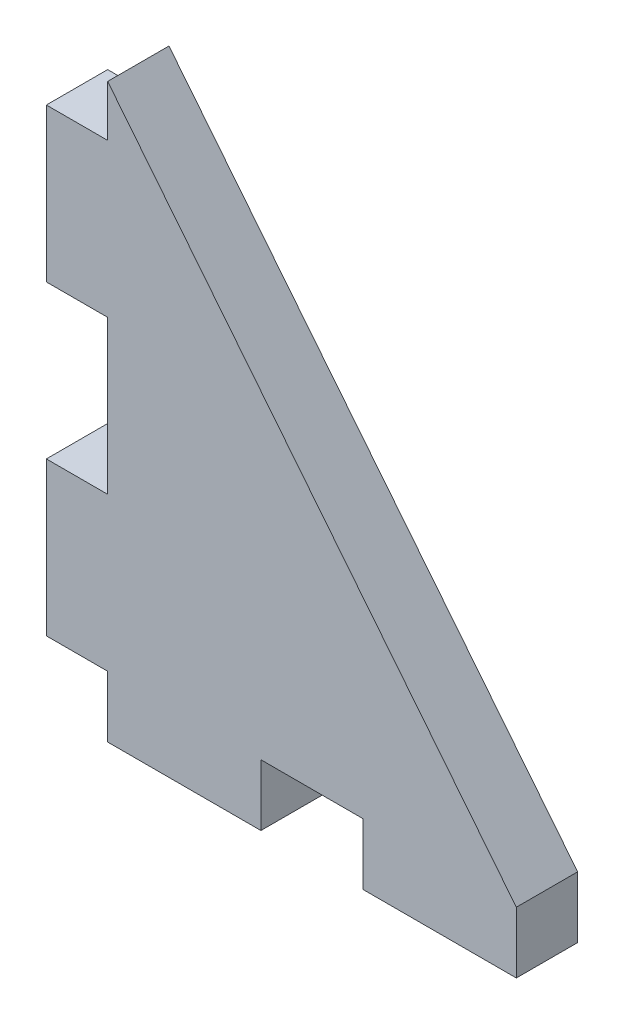
ISO-10303-21;
HEADER;
FILE_DESCRIPTION(('STEP AP214'),'2;1');
FILE_NAME('part.step','',(''),(''),'','','');
FILE_SCHEMA(('AUTOMOTIVE_DESIGN { 1 0 10303 214 1 1 1 1 }'));
ENDSEC;
DATA;
#1=APPLICATION_CONTEXT('core data for automotive mechanical design processes');
#2=APPLICATION_PROTOCOL_DEFINITION('international standard','automotive_design',2000,#1);
#3=PRODUCT_CONTEXT('',#1,'mechanical');
#4=PRODUCT('Part','Part','',(#3));
#5=PRODUCT_RELATED_PRODUCT_CATEGORY('part','',(#4));
#6=PRODUCT_DEFINITION_FORMATION('','',#4);
#7=PRODUCT_DEFINITION_CONTEXT('part definition',#1,'design');
#8=PRODUCT_DEFINITION('design','',#6,#7);
#9=PRODUCT_DEFINITION_SHAPE('','',#8);
#10=(LENGTH_UNIT() NAMED_UNIT(*) SI_UNIT(.MILLI.,.METRE.));
#11=(NAMED_UNIT(*) PLANE_ANGLE_UNIT() SI_UNIT($,.RADIAN.));
#12=(NAMED_UNIT(*) SI_UNIT($,.STERADIAN.) SOLID_ANGLE_UNIT());
#13=UNCERTAINTY_MEASURE_WITH_UNIT(LENGTH_MEASURE(1.E-05),#10,'distance_accuracy_value','');
#14=(GEOMETRIC_REPRESENTATION_CONTEXT(3) GLOBAL_UNCERTAINTY_ASSIGNED_CONTEXT((#13)) GLOBAL_UNIT_ASSIGNED_CONTEXT((#10,
#11,#12)) REPRESENTATION_CONTEXT('',''));
#15=CARTESIAN_POINT('',(0.,0.,0.));
#16=DIRECTION('',(0.,0.,1.));
#17=DIRECTION('',(1.,0.,0.));
#18=AXIS2_PLACEMENT_3D('',#15,#16,#17);
#19=CARTESIAN_POINT('',(0.,0.,3.));
#20=DIRECTION('',(1.,0.,0.));
#21=DIRECTION('',(0.,1.,0.));
#22=AXIS2_PLACEMENT_3D('',#19,#20,#21);
#23=PLANE('',#22);
#24=DIRECTION('',(0.,-1.,0.));
#25=VECTOR('',#24,1.);
#26=CARTESIAN_POINT('',(0.,0.,-3.));
#27=LINE('',#26,#25);
#28=CARTESIAN_POINT('',(0.,0.,-3.));
#29=VERTEX_POINT('',#28);
#30=CARTESIAN_POINT('',(0.,-6.,-3.));
#31=VERTEX_POINT('',#30);
#32=EDGE_CURVE('E179',#29,#31,#27,.T.);
#33=ORIENTED_EDGE('',*,*,#32,.T.);
#34=DIRECTION('',(0.,0.,-1.));
#35=VECTOR('',#34,1.);
#36=CARTESIAN_POINT('',(0.,-6.,3.));
#37=LINE('',#36,#35);
#38=CARTESIAN_POINT('',(0.,-6.,3.));
#39=VERTEX_POINT('',#38);
#40=EDGE_CURVE('E11',#39,#31,#37,.T.);
#41=ORIENTED_EDGE('',*,*,#40,.F.);
#42=DIRECTION('',(0.,-1.,0.));
#43=VECTOR('',#42,1.);
#44=CARTESIAN_POINT('',(0.,0.,3.));
#45=LINE('',#44,#43);
#46=CARTESIAN_POINT('',(0.,0.,3.));
#47=VERTEX_POINT('',#46);
#48=EDGE_CURVE('E209',#47,#39,#45,.T.);
#49=ORIENTED_EDGE('',*,*,#48,.F.);
#50=DIRECTION('',(0.,0.,-1.));
#51=VECTOR('',#50,1.);
#52=CARTESIAN_POINT('',(0.,0.,3.));
#53=LINE('',#52,#51);
#54=EDGE_CURVE('E175',#47,#29,#53,.T.);
#55=ORIENTED_EDGE('',*,*,#54,.T.);
#56=EDGE_LOOP('',(#33,#41,#49,#55));
#57=FACE_BOUND('',#56,.T.);
#58=ADVANCED_FACE('F35',(#57),#23,.F.);
#59=CARTESIAN_POINT('',(0.,-6.,3.));
#60=DIRECTION('',(0.,1.,0.));
#61=DIRECTION('',(0.,0.,1.));
#62=AXIS2_PLACEMENT_3D('',#59,#60,#61);
#63=PLANE('',#62);
#64=DIRECTION('',(1.,0.,0.));
#65=VECTOR('',#64,1.);
#66=CARTESIAN_POINT('',(0.,-6.,-3.));
#67=LINE('',#66,#65);
#68=CARTESIAN_POINT('',(15.,-6.,-3.));
#69=VERTEX_POINT('',#68);
#70=EDGE_CURVE('E182',#31,#69,#67,.T.);
#71=ORIENTED_EDGE('',*,*,#70,.T.);
#72=DIRECTION('',(0.,0.,-1.));
#73=VECTOR('',#72,1.);
#74=CARTESIAN_POINT('',(15.,-6.,3.));
#75=LINE('',#74,#73);
#76=CARTESIAN_POINT('',(15.,-6.,3.));
#77=VERTEX_POINT('',#76);
#78=EDGE_CURVE('E43',#77,#69,#75,.T.);
#79=ORIENTED_EDGE('',*,*,#78,.F.);
#80=DIRECTION('',(1.,0.,0.));
#81=VECTOR('',#80,1.);
#82=CARTESIAN_POINT('',(0.,-6.,3.));
#83=LINE('',#82,#81);
#84=EDGE_CURVE('E118',#39,#77,#83,.T.);
#85=ORIENTED_EDGE('',*,*,#84,.F.);
#86=ORIENTED_EDGE('',*,*,#40,.T.);
#87=EDGE_LOOP('',(#71,#79,#85,#86));
#88=FACE_BOUND('',#87,.T.);
#89=ADVANCED_FACE('F307',(#88),#63,.F.);
#90=CARTESIAN_POINT('',(15.,0.,3.));
#91=DIRECTION('',(-1.,0.,0.));
#92=DIRECTION('',(0.,0.,1.));
#93=AXIS2_PLACEMENT_3D('',#90,#91,#92);
#94=PLANE('',#93);
#95=DIRECTION('',(0.,1.,0.));
#96=VECTOR('',#95,1.);
#97=CARTESIAN_POINT('',(15.,0.,-3.));
#98=LINE('',#97,#96);
#99=CARTESIAN_POINT('',(15.,0.,-3.));
#100=VERTEX_POINT('',#99);
#101=EDGE_CURVE('E184',#69,#100,#98,.T.);
#102=ORIENTED_EDGE('',*,*,#101,.T.);
#103=DIRECTION('',(0.,0.,-1.));
#104=VECTOR('',#103,1.);
#105=CARTESIAN_POINT('',(15.,0.,3.));
#106=LINE('',#105,#104);
#107=CARTESIAN_POINT('',(15.,0.,3.));
#108=VERTEX_POINT('',#107);
#109=EDGE_CURVE('E240',#108,#100,#106,.T.);
#110=ORIENTED_EDGE('',*,*,#109,.F.);
#111=DIRECTION('',(0.,1.,0.));
#112=VECTOR('',#111,1.);
#113=CARTESIAN_POINT('',(15.,0.,3.));
#114=LINE('',#113,#112);
#115=EDGE_CURVE('E248',#77,#108,#114,.T.);
#116=ORIENTED_EDGE('',*,*,#115,.F.);
#117=ORIENTED_EDGE('',*,*,#78,.T.);
#118=EDGE_LOOP('',(#102,#110,#116,#117));
#119=FACE_BOUND('',#118,.T.);
#120=ADVANCED_FACE('F246',(#119),#94,.F.);
#121=CARTESIAN_POINT('',(25.,0.,3.));
#122=DIRECTION('',(0.,1.,0.));
#123=DIRECTION('',(-1.,0.,0.));
#124=AXIS2_PLACEMENT_3D('',#121,#122,#123);
#125=PLANE('',#124);
#126=DIRECTION('',(1.,0.,0.));
#127=VECTOR('',#126,1.);
#128=CARTESIAN_POINT('',(25.,0.,-3.));
#129=LINE('',#128,#127);
#130=CARTESIAN_POINT('',(25.,0.,-3.));
#131=VERTEX_POINT('',#130);
#132=EDGE_CURVE('E186',#100,#131,#129,.T.);
#133=ORIENTED_EDGE('',*,*,#132,.T.);
#134=DIRECTION('',(0.,0.,-1.));
#135=VECTOR('',#134,1.);
#136=CARTESIAN_POINT('',(25.,0.,3.));
#137=LINE('',#136,#135);
#138=CARTESIAN_POINT('',(25.,0.,3.));
#139=VERTEX_POINT('',#138);
#140=EDGE_CURVE('E237',#139,#131,#137,.T.);
#141=ORIENTED_EDGE('',*,*,#140,.F.);
#142=DIRECTION('',(1.,0.,0.));
#143=VECTOR('',#142,1.);
#144=CARTESIAN_POINT('',(25.,0.,3.));
#145=LINE('',#144,#143);
#146=EDGE_CURVE('E266',#108,#139,#145,.T.);
#147=ORIENTED_EDGE('',*,*,#146,.F.);
#148=ORIENTED_EDGE('',*,*,#109,.T.);
#149=EDGE_LOOP('',(#133,#141,#147,#148));
#150=FACE_BOUND('',#149,.T.);
#151=ADVANCED_FACE('F257',(#150),#125,.F.);
#152=CARTESIAN_POINT('',(25.,0.,3.));
#153=DIRECTION('',(1.,0.,0.));
#154=DIRECTION('',(0.,0.,-1.));
#155=AXIS2_PLACEMENT_3D('',#152,#153,#154);
#156=PLANE('',#155);
#157=DIRECTION('',(0.,-1.,0.));
#158=VECTOR('',#157,1.);
#159=CARTESIAN_POINT('',(25.,0.,-3.));
#160=LINE('',#159,#158);
#161=CARTESIAN_POINT('',(25.,-6.,-3.));
#162=VERTEX_POINT('',#161);
#163=EDGE_CURVE('E188',#131,#162,#160,.T.);
#164=ORIENTED_EDGE('',*,*,#163,.T.);
#165=DIRECTION('',(0.,0.,-1.));
#166=VECTOR('',#165,1.);
#167=CARTESIAN_POINT('',(25.,-6.,3.));
#168=LINE('',#167,#166);
#169=CARTESIAN_POINT('',(25.,-6.,3.));
#170=VERTEX_POINT('',#169);
#171=EDGE_CURVE('E234',#170,#162,#168,.T.);
#172=ORIENTED_EDGE('',*,*,#171,.F.);
#173=DIRECTION('',(0.,-1.,0.));
#174=VECTOR('',#173,1.);
#175=CARTESIAN_POINT('',(25.,0.,3.));
#176=LINE('',#175,#174);
#177=EDGE_CURVE('E263',#139,#170,#176,.T.);
#178=ORIENTED_EDGE('',*,*,#177,.F.);
#179=ORIENTED_EDGE('',*,*,#140,.T.);
#180=EDGE_LOOP('',(#164,#172,#178,#179));
#181=FACE_BOUND('',#180,.T.);
#182=ADVANCED_FACE('F261',(#181),#156,.F.);
#183=CARTESIAN_POINT('',(25.,-6.,3.));
#184=DIRECTION('',(0.,1.,0.));
#185=DIRECTION('',(0.,0.,1.));
#186=AXIS2_PLACEMENT_3D('',#183,#184,#185);
#187=PLANE('',#186);
#188=DIRECTION('',(1.,0.,0.));
#189=VECTOR('',#188,1.);
#190=CARTESIAN_POINT('',(25.,-6.,-3.));
#191=LINE('',#190,#189);
#192=CARTESIAN_POINT('',(40.,-6.,-3.));
#193=VERTEX_POINT('',#192);
#194=EDGE_CURVE('E190',#162,#193,#191,.T.);
#195=ORIENTED_EDGE('',*,*,#194,.T.);
#196=DIRECTION('',(0.,0.,-1.));
#197=VECTOR('',#196,1.);
#198=CARTESIAN_POINT('',(40.,-6.,3.));
#199=LINE('',#198,#197);
#200=CARTESIAN_POINT('',(40.,-6.,3.));
#201=VERTEX_POINT('',#200);
#202=EDGE_CURVE('E231',#201,#193,#199,.T.);
#203=ORIENTED_EDGE('',*,*,#202,.F.);
#204=DIRECTION('',(1.,0.,0.));
#205=VECTOR('',#204,1.);
#206=CARTESIAN_POINT('',(25.,-6.,3.));
#207=LINE('',#206,#205);
#208=EDGE_CURVE('E265',#170,#201,#207,.T.);
#209=ORIENTED_EDGE('',*,*,#208,.F.);
#210=ORIENTED_EDGE('',*,*,#171,.T.);
#211=EDGE_LOOP('',(#195,#203,#209,#210));
#212=FACE_BOUND('',#211,.T.);
#213=ADVANCED_FACE('F320',(#212),#187,.F.);
#214=CARTESIAN_POINT('',(40.,0.,3.));
#215=DIRECTION('',(-1.,0.,0.));
#216=DIRECTION('',(0.,0.,1.));
#217=AXIS2_PLACEMENT_3D('',#214,#215,#216);
#218=PLANE('',#217);
#219=DIRECTION('',(0.,1.,0.));
#220=VECTOR('',#219,1.);
#221=CARTESIAN_POINT('',(40.,0.,-3.));
#222=LINE('',#221,#220);
#223=CARTESIAN_POINT('',(40.,0.,-3.));
#224=VERTEX_POINT('',#223);
#225=EDGE_CURVE('E192',#193,#224,#222,.T.);
#226=ORIENTED_EDGE('',*,*,#225,.T.);
#227=DIRECTION('',(0.,0.,-1.));
#228=VECTOR('',#227,1.);
#229=CARTESIAN_POINT('',(40.,0.,3.));
#230=LINE('',#229,#228);
#231=CARTESIAN_POINT('',(40.,0.,3.));
#232=VERTEX_POINT('',#231);
#233=EDGE_CURVE('E228',#232,#224,#230,.T.);
#234=ORIENTED_EDGE('',*,*,#233,.F.);
#235=DIRECTION('',(0.,1.,0.));
#236=VECTOR('',#235,1.);
#237=CARTESIAN_POINT('',(40.,0.,3.));
#238=LINE('',#237,#236);
#239=EDGE_CURVE('E268',#201,#232,#238,.T.);
#240=ORIENTED_EDGE('',*,*,#239,.F.);
#241=ORIENTED_EDGE('',*,*,#202,.T.);
#242=EDGE_LOOP('',(#226,#234,#240,#241));
#243=FACE_BOUND('',#242,.T.);
#244=ADVANCED_FACE('F323',(#243),#218,.F.);
#245=CARTESIAN_POINT('',(0.,50.,3.));
#246=DIRECTION('',(-0.78086880944303,-0.624695047554424,0.));
#247=DIRECTION('',(0.624695047554424,-0.78086880944303,0.));
#248=AXIS2_PLACEMENT_3D('',#245,#246,#247);
#249=PLANE('',#248);
#250=DIRECTION('',(-0.624695047554424,0.78086880944303,0.));
#251=VECTOR('',#250,1.);
#252=CARTESIAN_POINT('',(0.,50.,-3.));
#253=LINE('',#252,#251);
#254=CARTESIAN_POINT('',(0.,50.,-3.));
#255=VERTEX_POINT('',#254);
#256=EDGE_CURVE('E194',#224,#255,#253,.T.);
#257=ORIENTED_EDGE('',*,*,#256,.T.);
#258=DIRECTION('',(0.,0.,-1.));
#259=VECTOR('',#258,1.);
#260=CARTESIAN_POINT('',(0.,50.,3.));
#261=LINE('',#260,#259);
#262=CARTESIAN_POINT('',(0.,50.,3.));
#263=VERTEX_POINT('',#262);
#264=EDGE_CURVE('E225',#263,#255,#261,.T.);
#265=ORIENTED_EDGE('',*,*,#264,.F.);
#266=DIRECTION('',(-0.624695047554424,0.78086880944303,0.));
#267=VECTOR('',#266,1.);
#268=CARTESIAN_POINT('',(0.,50.,3.));
#269=LINE('',#268,#267);
#270=EDGE_CURVE('E274',#232,#263,#269,.T.);
#271=ORIENTED_EDGE('',*,*,#270,.F.);
#272=ORIENTED_EDGE('',*,*,#233,.T.);
#273=EDGE_LOOP('',(#257,#265,#271,#272));
#274=FACE_BOUND('',#273,.T.);
#275=ADVANCED_FACE('F327',(#274),#249,.F.);
#276=CARTESIAN_POINT('',(0.,45.,3.));
#277=DIRECTION('',(1.,0.,0.));
#278=DIRECTION('',(0.,1.,0.));
#279=AXIS2_PLACEMENT_3D('',#276,#277,#278);
#280=PLANE('',#279);
#281=DIRECTION('',(0.,-1.,0.));
#282=VECTOR('',#281,1.);
#283=CARTESIAN_POINT('',(0.,45.,-3.));
#284=LINE('',#283,#282);
#285=CARTESIAN_POINT('',(0.,45.,-3.));
#286=VERTEX_POINT('',#285);
#287=EDGE_CURVE('E196',#255,#286,#284,.T.);
#288=ORIENTED_EDGE('',*,*,#287,.T.);
#289=DIRECTION('',(0.,0.,-1.));
#290=VECTOR('',#289,1.);
#291=CARTESIAN_POINT('',(0.,45.,3.));
#292=LINE('',#291,#290);
#293=CARTESIAN_POINT('',(0.,45.,3.));
#294=VERTEX_POINT('',#293);
#295=EDGE_CURVE('E222',#294,#286,#292,.T.);
#296=ORIENTED_EDGE('',*,*,#295,.F.);
#297=DIRECTION('',(0.,-1.,0.));
#298=VECTOR('',#297,1.);
#299=CARTESIAN_POINT('',(0.,45.,3.));
#300=LINE('',#299,#298);
#301=EDGE_CURVE('E276',#263,#294,#300,.T.);
#302=ORIENTED_EDGE('',*,*,#301,.F.);
#303=ORIENTED_EDGE('',*,*,#264,.T.);
#304=EDGE_LOOP('',(#288,#296,#302,#303));
#305=FACE_BOUND('',#304,.T.);
#306=ADVANCED_FACE('F331',(#305),#280,.F.);
#307=CARTESIAN_POINT('',(0.,45.,3.));
#308=DIRECTION('',(0.,-1.,0.));
#309=DIRECTION('',(0.,0.,-1.));
#310=AXIS2_PLACEMENT_3D('',#307,#308,#309);
#311=PLANE('',#310);
#312=DIRECTION('',(-1.,0.,0.));
#313=VECTOR('',#312,1.);
#314=CARTESIAN_POINT('',(0.,45.,-3.));
#315=LINE('',#314,#313);
#316=CARTESIAN_POINT('',(-6.,45.,-3.));
#317=VERTEX_POINT('',#316);
#318=EDGE_CURVE('E198',#286,#317,#315,.T.);
#319=ORIENTED_EDGE('',*,*,#318,.T.);
#320=DIRECTION('',(0.,0.,-1.));
#321=VECTOR('',#320,1.);
#322=CARTESIAN_POINT('',(-6.,45.,3.));
#323=LINE('',#322,#321);
#324=CARTESIAN_POINT('',(-6.,45.,3.));
#325=VERTEX_POINT('',#324);
#326=EDGE_CURVE('E219',#325,#317,#323,.T.);
#327=ORIENTED_EDGE('',*,*,#326,.F.);
#328=DIRECTION('',(-1.,0.,0.));
#329=VECTOR('',#328,1.);
#330=CARTESIAN_POINT('',(0.,45.,3.));
#331=LINE('',#330,#329);
#332=EDGE_CURVE('E278',#294,#325,#331,.T.);
#333=ORIENTED_EDGE('',*,*,#332,.F.);
#334=ORIENTED_EDGE('',*,*,#295,.T.);
#335=EDGE_LOOP('',(#319,#327,#333,#334));
#336=FACE_BOUND('',#335,.T.);
#337=ADVANCED_FACE('F335',(#336),#311,.F.);
#338=CARTESIAN_POINT('',(-6.,45.,3.));
#339=DIRECTION('',(1.,0.,0.));
#340=DIRECTION('',(0.,1.,0.));
#341=AXIS2_PLACEMENT_3D('',#338,#339,#340);
#342=PLANE('',#341);
#343=DIRECTION('',(0.,-1.,0.));
#344=VECTOR('',#343,1.);
#345=CARTESIAN_POINT('',(-6.,45.,-3.));
#346=LINE('',#345,#344);
#347=CARTESIAN_POINT('',(-5.99999999999999,30.,-3.));
#348=VERTEX_POINT('',#347);
#349=EDGE_CURVE('E200',#317,#348,#346,.T.);
#350=ORIENTED_EDGE('',*,*,#349,.T.);
#351=DIRECTION('',(0.,0.,-1.));
#352=VECTOR('',#351,1.);
#353=CARTESIAN_POINT('',(-5.99999999999999,30.,3.));
#354=LINE('',#353,#352);
#355=CARTESIAN_POINT('',(-5.99999999999999,30.,3.));
#356=VERTEX_POINT('',#355);
#357=EDGE_CURVE('E216',#356,#348,#354,.T.);
#358=ORIENTED_EDGE('',*,*,#357,.F.);
#359=DIRECTION('',(0.,-1.,0.));
#360=VECTOR('',#359,1.);
#361=CARTESIAN_POINT('',(-6.,45.,3.));
#362=LINE('',#361,#360);
#363=EDGE_CURVE('E280',#325,#356,#362,.T.);
#364=ORIENTED_EDGE('',*,*,#363,.F.);
#365=ORIENTED_EDGE('',*,*,#326,.T.);
#366=EDGE_LOOP('',(#350,#358,#364,#365));
#367=FACE_BOUND('',#366,.T.);
#368=ADVANCED_FACE('F339',(#367),#342,.F.);
#369=CARTESIAN_POINT('',(0.,30.,3.));
#370=DIRECTION('',(0.,1.,0.));
#371=DIRECTION('',(0.,0.,1.));
#372=AXIS2_PLACEMENT_3D('',#369,#370,#371);
#373=PLANE('',#372);
#374=DIRECTION('',(1.,0.,0.));
#375=VECTOR('',#374,1.);
#376=CARTESIAN_POINT('',(0.,30.,-3.));
#377=LINE('',#376,#375);
#378=CARTESIAN_POINT('',(0.,30.,-3.));
#379=VERTEX_POINT('',#378);
#380=EDGE_CURVE('E202',#348,#379,#377,.T.);
#381=ORIENTED_EDGE('',*,*,#380,.T.);
#382=DIRECTION('',(0.,0.,-1.));
#383=VECTOR('',#382,1.);
#384=CARTESIAN_POINT('',(0.,30.,3.));
#385=LINE('',#384,#383);
#386=CARTESIAN_POINT('',(0.,30.,3.));
#387=VERTEX_POINT('',#386);
#388=EDGE_CURVE('E213',#387,#379,#385,.T.);
#389=ORIENTED_EDGE('',*,*,#388,.F.);
#390=DIRECTION('',(1.,0.,0.));
#391=VECTOR('',#390,1.);
#392=CARTESIAN_POINT('',(0.,30.,3.));
#393=LINE('',#392,#391);
#394=EDGE_CURVE('E282',#356,#387,#393,.T.);
#395=ORIENTED_EDGE('',*,*,#394,.F.);
#396=ORIENTED_EDGE('',*,*,#357,.T.);
#397=EDGE_LOOP('',(#381,#389,#395,#396));
#398=FACE_BOUND('',#397,.T.);
#399=ADVANCED_FACE('F288',(#398),#373,.F.);
#400=CARTESIAN_POINT('',(0.,15.,3.));
#401=DIRECTION('',(1.,0.,0.));
#402=DIRECTION('',(0.,1.,0.));
#403=AXIS2_PLACEMENT_3D('',#400,#401,#402);
#404=PLANE('',#403);
#405=DIRECTION('',(0.,-1.,0.));
#406=VECTOR('',#405,1.);
#407=CARTESIAN_POINT('',(0.,15.,-3.));
#408=LINE('',#407,#406);
#409=CARTESIAN_POINT('',(0.,15.,-3.));
#410=VERTEX_POINT('',#409);
#411=EDGE_CURVE('E204',#379,#410,#408,.T.);
#412=ORIENTED_EDGE('',*,*,#411,.T.);
#413=DIRECTION('',(0.,0.,-1.));
#414=VECTOR('',#413,1.);
#415=CARTESIAN_POINT('',(0.,15.,3.));
#416=LINE('',#415,#414);
#417=CARTESIAN_POINT('',(0.,15.,3.));
#418=VERTEX_POINT('',#417);
#419=EDGE_CURVE('E170',#418,#410,#416,.T.);
#420=ORIENTED_EDGE('',*,*,#419,.F.);
#421=DIRECTION('',(0.,-1.,0.));
#422=VECTOR('',#421,1.);
#423=CARTESIAN_POINT('',(0.,15.,3.));
#424=LINE('',#423,#422);
#425=EDGE_CURVE('E161',#387,#418,#424,.T.);
#426=ORIENTED_EDGE('',*,*,#425,.F.);
#427=ORIENTED_EDGE('',*,*,#388,.T.);
#428=EDGE_LOOP('',(#412,#420,#426,#427));
#429=FACE_BOUND('',#428,.T.);
#430=ADVANCED_FACE('F292',(#429),#404,.F.);
#431=CARTESIAN_POINT('',(0.,15.,3.));
#432=DIRECTION('',(0.,-1.,0.));
#433=DIRECTION('',(0.,0.,-1.));
#434=AXIS2_PLACEMENT_3D('',#431,#432,#433);
#435=PLANE('',#434);
#436=DIRECTION('',(-1.,0.,0.));
#437=VECTOR('',#436,1.);
#438=CARTESIAN_POINT('',(0.,15.,-3.));
#439=LINE('',#438,#437);
#440=CARTESIAN_POINT('',(-6.,15.,-3.));
#441=VERTEX_POINT('',#440);
#442=EDGE_CURVE('E169',#410,#441,#439,.T.);
#443=ORIENTED_EDGE('',*,*,#442,.T.);
#444=DIRECTION('',(0.,0.,-1.));
#445=VECTOR('',#444,1.);
#446=CARTESIAN_POINT('',(-6.,15.,3.));
#447=LINE('',#446,#445);
#448=CARTESIAN_POINT('',(-6.,15.,3.));
#449=VERTEX_POINT('',#448);
#450=EDGE_CURVE('E166',#449,#441,#447,.T.);
#451=ORIENTED_EDGE('',*,*,#450,.F.);
#452=DIRECTION('',(-1.,0.,0.));
#453=VECTOR('',#452,1.);
#454=CARTESIAN_POINT('',(0.,15.,3.));
#455=LINE('',#454,#453);
#456=EDGE_CURVE('E155',#418,#449,#455,.T.);
#457=ORIENTED_EDGE('',*,*,#456,.F.);
#458=ORIENTED_EDGE('',*,*,#419,.T.);
#459=EDGE_LOOP('',(#443,#451,#457,#458));
#460=FACE_BOUND('',#459,.T.);
#461=ADVANCED_FACE('F167',(#460),#435,.F.);
#462=CARTESIAN_POINT('',(-6.,0.,3.));
#463=DIRECTION('',(1.,0.,0.));
#464=DIRECTION('',(0.,0.,-1.));
#465=AXIS2_PLACEMENT_3D('',#462,#463,#464);
#466=PLANE('',#465);
#467=DIRECTION('',(0.,-1.,0.));
#468=VECTOR('',#467,1.);
#469=CARTESIAN_POINT('',(-6.,0.,-3.));
#470=LINE('',#469,#468);
#471=CARTESIAN_POINT('',(-6.,0.,-3.));
#472=VERTEX_POINT('',#471);
#473=EDGE_CURVE('E104',#441,#472,#470,.T.);
#474=ORIENTED_EDGE('',*,*,#473,.T.);
#475=DIRECTION('',(0.,0.,-1.));
#476=VECTOR('',#475,1.);
#477=CARTESIAN_POINT('',(-6.,0.,3.));
#478=LINE('',#477,#476);
#479=CARTESIAN_POINT('',(-6.,0.,3.));
#480=VERTEX_POINT('',#479);
#481=EDGE_CURVE('E171',#480,#472,#478,.T.);
#482=ORIENTED_EDGE('',*,*,#481,.F.);
#483=DIRECTION('',(0.,-1.,0.));
#484=VECTOR('',#483,1.);
#485=CARTESIAN_POINT('',(-6.,0.,3.));
#486=LINE('',#485,#484);
#487=EDGE_CURVE('E159',#449,#480,#486,.T.);
#488=ORIENTED_EDGE('',*,*,#487,.F.);
#489=ORIENTED_EDGE('',*,*,#450,.T.);
#490=EDGE_LOOP('',(#474,#482,#488,#489));
#491=FACE_BOUND('',#490,.T.);
#492=ADVANCED_FACE('F173',(#491),#466,.F.);
#493=CARTESIAN_POINT('',(0.,0.,3.));
#494=DIRECTION('',(0.,1.,0.));
#495=DIRECTION('',(-1.,0.,0.));
#496=AXIS2_PLACEMENT_3D('',#493,#494,#495);
#497=PLANE('',#496);
#498=DIRECTION('',(1.,0.,0.));
#499=VECTOR('',#498,1.);
#500=CARTESIAN_POINT('',(0.,0.,-3.));
#501=LINE('',#500,#499);
#502=EDGE_CURVE('E110',#472,#29,#501,.T.);
#503=ORIENTED_EDGE('',*,*,#502,.T.);
#504=ORIENTED_EDGE('',*,*,#54,.F.);
#505=DIRECTION('',(1.,0.,0.));
#506=VECTOR('',#505,1.);
#507=CARTESIAN_POINT('',(0.,0.,3.));
#508=LINE('',#507,#506);
#509=EDGE_CURVE('E51',#480,#47,#508,.T.);
#510=ORIENTED_EDGE('',*,*,#509,.F.);
#511=ORIENTED_EDGE('',*,*,#481,.T.);
#512=EDGE_LOOP('',(#503,#504,#510,#511));
#513=FACE_BOUND('',#512,.T.);
#514=ADVANCED_FACE('F296',(#513),#497,.F.);
#515=CARTESIAN_POINT('',(0.,0.,3.));
#516=DIRECTION('',(0.,0.,1.));
#517=DIRECTION('',(1.,0.,0.));
#518=AXIS2_PLACEMENT_3D('',#515,#516,#517);
#519=PLANE('',#518);
#520=ORIENTED_EDGE('',*,*,#48,.T.);
#521=ORIENTED_EDGE('',*,*,#84,.T.);
#522=ORIENTED_EDGE('',*,*,#115,.T.);
#523=ORIENTED_EDGE('',*,*,#146,.T.);
#524=ORIENTED_EDGE('',*,*,#177,.T.);
#525=ORIENTED_EDGE('',*,*,#208,.T.);
#526=ORIENTED_EDGE('',*,*,#239,.T.);
#527=ORIENTED_EDGE('',*,*,#270,.T.);
#528=ORIENTED_EDGE('',*,*,#301,.T.);
#529=ORIENTED_EDGE('',*,*,#332,.T.);
#530=ORIENTED_EDGE('',*,*,#363,.T.);
#531=ORIENTED_EDGE('',*,*,#394,.T.);
#532=ORIENTED_EDGE('',*,*,#425,.T.);
#533=ORIENTED_EDGE('',*,*,#456,.T.);
#534=ORIENTED_EDGE('',*,*,#487,.T.);
#535=ORIENTED_EDGE('',*,*,#509,.T.);
#536=EDGE_LOOP('',(#520,#521,#522,#523,#524,#525,#526,#527,#528,#529,#530,#531,#532,#533,#534,#535));
#537=FACE_BOUND('',#536,.T.);
#538=ADVANCED_FACE('F157',(#537),#519,.T.);
#539=CARTESIAN_POINT('',(0.,0.,-3.));
#540=DIRECTION('',(0.,0.,1.));
#541=DIRECTION('',(1.,0.,0.));
#542=AXIS2_PLACEMENT_3D('',#539,#540,#541);
#543=PLANE('',#542);
#544=ORIENTED_EDGE('',*,*,#32,.F.);
#545=ORIENTED_EDGE('',*,*,#502,.F.);
#546=ORIENTED_EDGE('',*,*,#473,.F.);
#547=ORIENTED_EDGE('',*,*,#442,.F.);
#548=ORIENTED_EDGE('',*,*,#411,.F.);
#549=ORIENTED_EDGE('',*,*,#380,.F.);
#550=ORIENTED_EDGE('',*,*,#349,.F.);
#551=ORIENTED_EDGE('',*,*,#318,.F.);
#552=ORIENTED_EDGE('',*,*,#287,.F.);
#553=ORIENTED_EDGE('',*,*,#256,.F.);
#554=ORIENTED_EDGE('',*,*,#225,.F.);
#555=ORIENTED_EDGE('',*,*,#194,.F.);
#556=ORIENTED_EDGE('',*,*,#163,.F.);
#557=ORIENTED_EDGE('',*,*,#132,.F.);
#558=ORIENTED_EDGE('',*,*,#101,.F.);
#559=ORIENTED_EDGE('',*,*,#70,.F.);
#560=EDGE_LOOP('',(#544,#545,#546,#547,#548,#549,#550,#551,#552,#553,#554,#555,#556,#557,#558,#559));
#561=FACE_BOUND('',#560,.T.);
#562=ADVANCED_FACE('F252',(#561),#543,.F.);
#563=CLOSED_SHELL('',(#58,#89,#120,#151,#182,#213,#244,#275,#306,#337,#368,#399,#430,#461,#492,
#514,#538,#562));
#564=MANIFOLD_SOLID_BREP('B2',#563);
#565=ADVANCED_BREP_SHAPE_REPRESENTATION('',(#18,#564),#14);
#566=SHAPE_DEFINITION_REPRESENTATION(#9,#565);
ENDSEC;
END-ISO-10303-21;
